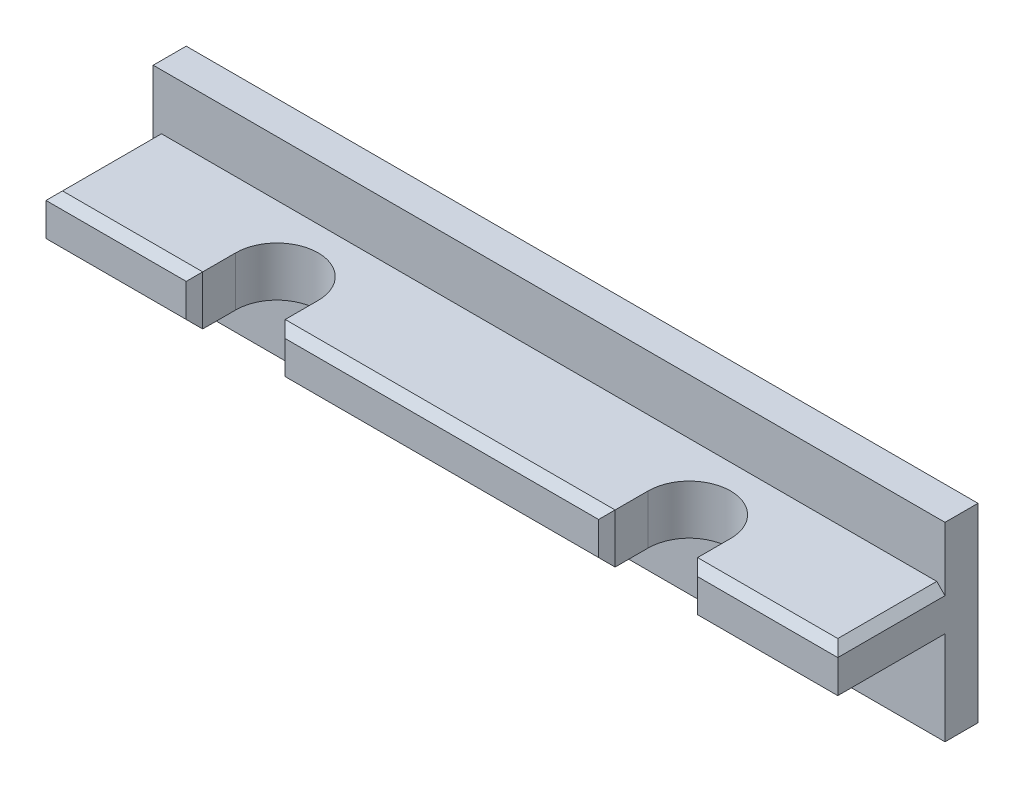
ISO-10303-21;
HEADER;
FILE_DESCRIPTION(('STEP AP214'),'2;1');
FILE_NAME('part.step','',(''),(''),'','','');
FILE_SCHEMA(('AUTOMOTIVE_DESIGN { 1 0 10303 214 1 1 1 1 }'));
ENDSEC;
DATA;
#1=APPLICATION_CONTEXT('core data for automotive mechanical design processes');
#2=APPLICATION_PROTOCOL_DEFINITION('international standard','automotive_design',2000,#1);
#3=PRODUCT_CONTEXT('',#1,'mechanical');
#4=PRODUCT('Part','Part','',(#3));
#5=PRODUCT_RELATED_PRODUCT_CATEGORY('part','',(#4));
#6=PRODUCT_DEFINITION_FORMATION('','',#4);
#7=PRODUCT_DEFINITION_CONTEXT('part definition',#1,'design');
#8=PRODUCT_DEFINITION('design','',#6,#7);
#9=PRODUCT_DEFINITION_SHAPE('','',#8);
#10=(LENGTH_UNIT() NAMED_UNIT(*) SI_UNIT(.MILLI.,.METRE.));
#11=(NAMED_UNIT(*) PLANE_ANGLE_UNIT() SI_UNIT($,.RADIAN.));
#12=(NAMED_UNIT(*) SI_UNIT($,.STERADIAN.) SOLID_ANGLE_UNIT());
#13=UNCERTAINTY_MEASURE_WITH_UNIT(LENGTH_MEASURE(1.E-05),#10,'distance_accuracy_value','');
#14=(GEOMETRIC_REPRESENTATION_CONTEXT(3) GLOBAL_UNCERTAINTY_ASSIGNED_CONTEXT((#13)) GLOBAL_UNIT_ASSIGNED_CONTEXT((#10,
#11,#12)) REPRESENTATION_CONTEXT('',''));
#15=CARTESIAN_POINT('',(0.,0.,0.));
#16=DIRECTION('',(0.,0.,1.));
#17=DIRECTION('',(1.,0.,0.));
#18=AXIS2_PLACEMENT_3D('',#15,#16,#17);
#19=CARTESIAN_POINT('',(0.,0.,8.5));
#20=DIRECTION('',(0.,0.,1.));
#21=DIRECTION('',(1.,0.,0.));
#22=AXIS2_PLACEMENT_3D('',#19,#20,#21);
#23=PLANE('',#22);
#24=DIRECTION('',(1.,0.,0.));
#25=VECTOR('',#24,1.);
#26=CARTESIAN_POINT('',(10.,5.67500000000001,8.5));
#27=LINE('',#26,#25);
#28=CARTESIAN_POINT('',(-9.5,5.675,8.5));
#29=VERTEX_POINT('',#28);
#30=CARTESIAN_POINT('',(9.5,5.67500000000001,8.5));
#31=VERTEX_POINT('',#30);
#32=EDGE_CURVE('E401',#29,#31,#27,.T.);
#33=ORIENTED_EDGE('',*,*,#32,.T.);
#34=DIRECTION('',(0.,1.,0.));
#35=VECTOR('',#34,1.);
#36=CARTESIAN_POINT('',(9.5,8.17500000000001,8.5));
#37=LINE('',#36,#35);
#38=CARTESIAN_POINT('',(9.5,7.67500000000001,8.5));
#39=VERTEX_POINT('',#38);
#40=EDGE_CURVE('E404',#31,#39,#37,.T.);
#41=ORIENTED_EDGE('',*,*,#40,.T.);
#42=DIRECTION('',(-1.,0.,0.));
#43=VECTOR('',#42,1.);
#44=CARTESIAN_POINT('',(0.,7.67500000000001,8.5));
#45=LINE('',#44,#43);
#46=CARTESIAN_POINT('',(-9.5,7.675,8.5));
#47=VERTEX_POINT('',#46);
#48=EDGE_CURVE('E395',#39,#47,#45,.T.);
#49=ORIENTED_EDGE('',*,*,#48,.T.);
#50=DIRECTION('',(0.,-1.,0.));
#51=VECTOR('',#50,1.);
#52=CARTESIAN_POINT('',(-9.5,5.175,8.5));
#53=LINE('',#52,#51);
#54=EDGE_CURVE('E398',#47,#29,#53,.T.);
#55=ORIENTED_EDGE('',*,*,#54,.T.);
#56=EDGE_LOOP('',(#33,#41,#49,#55));
#57=FACE_BOUND('',#56,.T.);
#58=ADVANCED_FACE('F46',(#57),#23,.T.);
#59=DIRECTION('',(0.,-1.,0.));
#60=VECTOR('',#59,1.);
#61=CARTESIAN_POINT('',(15.5,5.17500000000001,8.5));
#62=LINE('',#61,#60);
#63=CARTESIAN_POINT('',(15.5,7.67499999999999,8.5));
#64=VERTEX_POINT('',#63);
#65=CARTESIAN_POINT('',(15.5,5.67500000000002,8.5));
#66=VERTEX_POINT('',#65);
#67=EDGE_CURVE('E65',#64,#66,#62,.T.);
#68=ORIENTED_EDGE('',*,*,#67,.T.);
#69=DIRECTION('',(1.,0.,0.));
#70=VECTOR('',#69,1.);
#71=CARTESIAN_POINT('',(24.,5.67500000000002,8.5));
#72=LINE('',#71,#70);
#73=CARTESIAN_POINT('',(24.,5.67500000000002,8.5));
#74=VERTEX_POINT('',#73);
#75=EDGE_CURVE('E422',#66,#74,#72,.T.);
#76=ORIENTED_EDGE('',*,*,#75,.T.);
#77=DIRECTION('',(0.,1.,0.));
#78=VECTOR('',#77,1.);
#79=CARTESIAN_POINT('',(24.,0.,8.5));
#80=LINE('',#79,#78);
#81=CARTESIAN_POINT('',(24.,7.675,8.5));
#82=VERTEX_POINT('',#81);
#83=EDGE_CURVE('E289',#74,#82,#80,.T.);
#84=ORIENTED_EDGE('',*,*,#83,.T.);
#85=DIRECTION('',(-1.,0.,0.));
#86=VECTOR('',#85,1.);
#87=CARTESIAN_POINT('',(0.,7.67499999999999,8.5));
#88=LINE('',#87,#86);
#89=EDGE_CURVE('E70',#82,#64,#88,.T.);
#90=ORIENTED_EDGE('',*,*,#89,.T.);
#91=EDGE_LOOP('',(#68,#76,#84,#90));
#92=FACE_BOUND('',#91,.T.);
#93=ADVANCED_FACE('F553',(#92),#23,.T.);
#94=CARTESIAN_POINT('',(0.,0.,2.));
#95=DIRECTION('',(0.,0.,1.));
#96=DIRECTION('',(1.,0.,0.));
#97=AXIS2_PLACEMENT_3D('',#94,#95,#96);
#98=PLANE('',#97);
#99=DIRECTION('',(0.,1.,0.));
#100=VECTOR('',#99,1.);
#101=CARTESIAN_POINT('',(24.,0.,2.));
#102=LINE('',#101,#100);
#103=CARTESIAN_POINT('',(24.,0.,2.));
#104=VERTEX_POINT('',#103);
#105=CARTESIAN_POINT('',(24.,5.67500000000002,2.));
#106=VERTEX_POINT('',#105);
#107=EDGE_CURVE('E300',#104,#106,#102,.T.);
#108=ORIENTED_EDGE('',*,*,#107,.T.);
#109=DIRECTION('',(0.707106781186546,0.707106781186549,0.));
#110=VECTOR('',#109,1.);
#111=CARTESIAN_POINT('',(24.,5.67500000000002,2.));
#112=LINE('',#111,#110);
#113=CARTESIAN_POINT('',(23.5,5.17500000000001,2.));
#114=VERTEX_POINT('',#113);
#115=EDGE_CURVE('E57',#106,#114,#112,.F.);
#116=ORIENTED_EDGE('',*,*,#115,.T.);
#117=DIRECTION('',(-1.,0.,0.));
#118=VECTOR('',#117,1.);
#119=CARTESIAN_POINT('',(0.,5.175,2.));
#120=LINE('',#119,#118);
#121=CARTESIAN_POINT('',(-23.5,5.175,2.));
#122=VERTEX_POINT('',#121);
#123=EDGE_CURVE('E295',#114,#122,#120,.T.);
#124=ORIENTED_EDGE('',*,*,#123,.T.);
#125=DIRECTION('',(0.707106781186543,-0.707106781186552,0.));
#126=VECTOR('',#125,1.);
#127=CARTESIAN_POINT('',(-23.5,5.175,2.));
#128=LINE('',#127,#126);
#129=CARTESIAN_POINT('',(-24.,5.67499999999999,2.));
#130=VERTEX_POINT('',#129);
#131=EDGE_CURVE('E427',#122,#130,#128,.F.);
#132=ORIENTED_EDGE('',*,*,#131,.T.);
#133=DIRECTION('',(0.,-1.,0.));
#134=VECTOR('',#133,1.);
#135=CARTESIAN_POINT('',(-24.,0.,2.));
#136=LINE('',#135,#134);
#137=CARTESIAN_POINT('',(-24.,0.,2.));
#138=VERTEX_POINT('',#137);
#139=EDGE_CURVE('E307',#130,#138,#136,.T.);
#140=ORIENTED_EDGE('',*,*,#139,.T.);
#141=DIRECTION('',(1.,0.,0.));
#142=VECTOR('',#141,1.);
#143=CARTESIAN_POINT('',(0.,0.,2.));
#144=LINE('',#143,#142);
#145=EDGE_CURVE('E311',#138,#104,#144,.T.);
#146=ORIENTED_EDGE('',*,*,#145,.T.);
#147=EDGE_LOOP('',(#108,#116,#124,#132,#140,#146));
#148=FACE_BOUND('',#147,.T.);
#149=ADVANCED_FACE('F563',(#148),#98,.T.);
#150=CARTESIAN_POINT('',(24.,0.,2.));
#151=DIRECTION('',(-1.,0.,0.));
#152=DIRECTION('',(0.,-1.,0.));
#153=AXIS2_PLACEMENT_3D('',#150,#151,#152);
#154=PLANE('',#153);
#155=ORIENTED_EDGE('',*,*,#83,.F.);
#156=DIRECTION('',(0.,0.,-1.));
#157=VECTOR('',#156,1.);
#158=CARTESIAN_POINT('',(24.,5.67500000000002,2.));
#159=LINE('',#158,#157);
#160=EDGE_CURVE('E414',#74,#106,#159,.T.);
#161=ORIENTED_EDGE('',*,*,#160,.T.);
#162=ORIENTED_EDGE('',*,*,#107,.F.);
#163=DIRECTION('',(0.,0.,-1.));
#164=VECTOR('',#163,1.);
#165=CARTESIAN_POINT('',(24.,0.,2.));
#166=LINE('',#165,#164);
#167=CARTESIAN_POINT('',(24.,0.,0.));
#168=VERTEX_POINT('',#167);
#169=EDGE_CURVE('E314',#104,#168,#166,.T.);
#170=ORIENTED_EDGE('',*,*,#169,.T.);
#171=DIRECTION('',(0.,1.,0.));
#172=VECTOR('',#171,1.);
#173=CARTESIAN_POINT('',(24.,0.,0.));
#174=LINE('',#173,#172);
#175=CARTESIAN_POINT('',(24.,11.525,0.));
#176=VERTEX_POINT('',#175);
#177=EDGE_CURVE('E299',#168,#176,#174,.T.);
#178=ORIENTED_EDGE('',*,*,#177,.T.);
#179=DIRECTION('',(0.,0.,-1.));
#180=VECTOR('',#179,1.);
#181=CARTESIAN_POINT('',(24.,11.525,2.));
#182=LINE('',#181,#180);
#183=CARTESIAN_POINT('',(24.,11.525,2.));
#184=VERTEX_POINT('',#183);
#185=EDGE_CURVE('E337',#184,#176,#182,.T.);
#186=ORIENTED_EDGE('',*,*,#185,.F.);
#187=CARTESIAN_POINT('',(24.,7.675,2.));
#188=VERTEX_POINT('',#187);
#189=EDGE_CURVE('E304',#188,#184,#102,.T.);
#190=ORIENTED_EDGE('',*,*,#189,.F.);
#191=DIRECTION('',(0.,0.,1.));
#192=VECTOR('',#191,1.);
#193=CARTESIAN_POINT('',(24.,7.675,8.5));
#194=LINE('',#193,#192);
#195=EDGE_CURVE('E411',#188,#82,#194,.T.);
#196=ORIENTED_EDGE('',*,*,#195,.T.);
#197=EDGE_LOOP('',(#155,#161,#162,#170,#178,#186,#190,#196));
#198=FACE_BOUND('',#197,.T.);
#199=ADVANCED_FACE('F555',(#198),#154,.F.);
#200=CARTESIAN_POINT('',(0.,11.525,2.));
#201=DIRECTION('',(0.,-1.,0.));
#202=DIRECTION('',(1.,0.,0.));
#203=AXIS2_PLACEMENT_3D('',#200,#201,#202);
#204=PLANE('',#203);
#205=DIRECTION('',(-1.,0.,0.));
#206=VECTOR('',#205,1.);
#207=CARTESIAN_POINT('',(0.,11.525,0.));
#208=LINE('',#207,#206);
#209=CARTESIAN_POINT('',(-24.,11.525,0.));
#210=VERTEX_POINT('',#209);
#211=EDGE_CURVE('E317',#176,#210,#208,.T.);
#212=ORIENTED_EDGE('',*,*,#211,.T.);
#213=DIRECTION('',(0.,0.,-1.));
#214=VECTOR('',#213,1.);
#215=CARTESIAN_POINT('',(-24.,11.525,2.));
#216=LINE('',#215,#214);
#217=CARTESIAN_POINT('',(-24.,11.525,2.));
#218=VERTEX_POINT('',#217);
#219=EDGE_CURVE('E333',#218,#210,#216,.T.);
#220=ORIENTED_EDGE('',*,*,#219,.F.);
#221=DIRECTION('',(-1.,0.,0.));
#222=VECTOR('',#221,1.);
#223=CARTESIAN_POINT('',(0.,11.525,2.));
#224=LINE('',#223,#222);
#225=EDGE_CURVE('E303',#184,#218,#224,.T.);
#226=ORIENTED_EDGE('',*,*,#225,.F.);
#227=ORIENTED_EDGE('',*,*,#185,.T.);
#228=EDGE_LOOP('',(#212,#220,#226,#227));
#229=FACE_BOUND('',#228,.T.);
#230=ADVANCED_FACE('F876',(#229),#204,.F.);
#231=CARTESIAN_POINT('',(-24.,0.,2.));
#232=DIRECTION('',(1.,0.,0.));
#233=DIRECTION('',(0.,1.,0.));
#234=AXIS2_PLACEMENT_3D('',#231,#232,#233);
#235=PLANE('',#234);
#236=ORIENTED_EDGE('',*,*,#139,.F.);
#237=DIRECTION('',(0.,0.,1.));
#238=VECTOR('',#237,1.);
#239=CARTESIAN_POINT('',(-24.,5.67499999999999,2.));
#240=LINE('',#239,#238);
#241=CARTESIAN_POINT('',(-24.,5.67499999999999,8.5));
#242=VERTEX_POINT('',#241);
#243=EDGE_CURVE('E361',#130,#242,#240,.T.);
#244=ORIENTED_EDGE('',*,*,#243,.T.);
#245=DIRECTION('',(0.,-1.,0.));
#246=VECTOR('',#245,1.);
#247=CARTESIAN_POINT('',(-24.,0.,8.5));
#248=LINE('',#247,#246);
#249=CARTESIAN_POINT('',(-24.,7.67500000000001,8.5));
#250=VERTEX_POINT('',#249);
#251=EDGE_CURVE('E285',#250,#242,#248,.T.);
#252=ORIENTED_EDGE('',*,*,#251,.F.);
#253=DIRECTION('',(0.,0.,-1.));
#254=VECTOR('',#253,1.);
#255=CARTESIAN_POINT('',(-24.,7.67500000000001,2.));
#256=LINE('',#255,#254);
#257=CARTESIAN_POINT('',(-24.,7.67500000000001,2.));
#258=VERTEX_POINT('',#257);
#259=EDGE_CURVE('E357',#250,#258,#256,.T.);
#260=ORIENTED_EDGE('',*,*,#259,.T.);
#261=EDGE_CURVE('E308',#218,#258,#136,.T.);
#262=ORIENTED_EDGE('',*,*,#261,.F.);
#263=ORIENTED_EDGE('',*,*,#219,.T.);
#264=DIRECTION('',(0.,-1.,0.));
#265=VECTOR('',#264,1.);
#266=CARTESIAN_POINT('',(-24.,0.,0.));
#267=LINE('',#266,#265);
#268=CARTESIAN_POINT('',(-24.,0.,0.));
#269=VERTEX_POINT('',#268);
#270=EDGE_CURVE('E320',#210,#269,#267,.T.);
#271=ORIENTED_EDGE('',*,*,#270,.T.);
#272=DIRECTION('',(0.,0.,-1.));
#273=VECTOR('',#272,1.);
#274=CARTESIAN_POINT('',(-24.,0.,2.));
#275=LINE('',#274,#273);
#276=EDGE_CURVE('E329',#138,#269,#275,.T.);
#277=ORIENTED_EDGE('',*,*,#276,.F.);
#278=EDGE_LOOP('',(#236,#244,#252,#260,#262,#263,#271,#277));
#279=FACE_BOUND('',#278,.T.);
#280=ADVANCED_FACE('F568',(#279),#235,.F.);
#281=CARTESIAN_POINT('',(0.,0.,2.));
#282=DIRECTION('',(0.,1.,0.));
#283=DIRECTION('',(-1.,0.,0.));
#284=AXIS2_PLACEMENT_3D('',#281,#282,#283);
#285=PLANE('',#284);
#286=DIRECTION('',(1.,0.,0.));
#287=VECTOR('',#286,1.);
#288=CARTESIAN_POINT('',(0.,0.,0.));
#289=LINE('',#288,#287);
#290=EDGE_CURVE('E323',#269,#168,#289,.T.);
#291=ORIENTED_EDGE('',*,*,#290,.T.);
#292=ORIENTED_EDGE('',*,*,#169,.F.);
#293=ORIENTED_EDGE('',*,*,#145,.F.);
#294=ORIENTED_EDGE('',*,*,#276,.T.);
#295=EDGE_LOOP('',(#291,#292,#293,#294));
#296=FACE_BOUND('',#295,.T.);
#297=ADVANCED_FACE('F572',(#296),#285,.F.);
#298=DIRECTION('',(-1.,0.,0.));
#299=VECTOR('',#298,1.);
#300=CARTESIAN_POINT('',(0.,8.17500000000001,2.));
#301=LINE('',#300,#299);
#302=CARTESIAN_POINT('',(23.5,8.17500000000001,2.));
#303=VERTEX_POINT('',#302);
#304=CARTESIAN_POINT('',(-23.5,8.175,2.));
#305=VERTEX_POINT('',#304);
#306=EDGE_CURVE('E292',#303,#305,#301,.T.);
#307=ORIENTED_EDGE('',*,*,#306,.F.);
#308=DIRECTION('',(0.707106781186548,-0.707106781186547,0.));
#309=VECTOR('',#308,1.);
#310=CARTESIAN_POINT('',(23.5,8.17500000000001,2.));
#311=LINE('',#310,#309);
#312=EDGE_CURVE('E11',#303,#188,#311,.T.);
#313=ORIENTED_EDGE('',*,*,#312,.T.);
#314=ORIENTED_EDGE('',*,*,#189,.T.);
#315=ORIENTED_EDGE('',*,*,#225,.T.);
#316=ORIENTED_EDGE('',*,*,#261,.T.);
#317=DIRECTION('',(0.707106781186542,0.707106781186553,0.));
#318=VECTOR('',#317,1.);
#319=CARTESIAN_POINT('',(-24.,7.67500000000001,2.));
#320=LINE('',#319,#318);
#321=EDGE_CURVE('E431',#258,#305,#320,.T.);
#322=ORIENTED_EDGE('',*,*,#321,.T.);
#323=EDGE_LOOP('',(#307,#313,#314,#315,#316,#322));
#324=FACE_BOUND('',#323,.T.);
#325=ADVANCED_FACE('F488',(#324),#98,.T.);
#326=CARTESIAN_POINT('',(0.,0.,0.));
#327=DIRECTION('',(0.,0.,1.));
#328=DIRECTION('',(1.,0.,0.));
#329=AXIS2_PLACEMENT_3D('',#326,#327,#328);
#330=PLANE('',#329);
#331=ORIENTED_EDGE('',*,*,#211,.F.);
#332=ORIENTED_EDGE('',*,*,#177,.F.);
#333=ORIENTED_EDGE('',*,*,#290,.F.);
#334=ORIENTED_EDGE('',*,*,#270,.F.);
#335=EDGE_LOOP('',(#331,#332,#333,#334));
#336=FACE_BOUND('',#335,.T.);
#337=ADVANCED_FACE('F832',(#336),#330,.F.);
#338=CARTESIAN_POINT('',(0.,5.175,8.5));
#339=DIRECTION('',(0.,1.,0.));
#340=DIRECTION('',(-1.,0.,0.));
#341=AXIS2_PLACEMENT_3D('',#338,#339,#340);
#342=PLANE('',#341);
#343=DIRECTION('',(-1.,0.,0.));
#344=VECTOR('',#343,1.);
#345=CARTESIAN_POINT('',(-24.,5.175,8.00000000000001));
#346=LINE('',#345,#344);
#347=CARTESIAN_POINT('',(-15.,5.175,8.00000000000001));
#348=VERTEX_POINT('',#347);
#349=CARTESIAN_POINT('',(-23.5,5.175,8.00000000000001));
#350=VERTEX_POINT('',#349);
#351=EDGE_CURVE('E350',#348,#350,#346,.T.);
#352=ORIENTED_EDGE('',*,*,#351,.T.);
#353=DIRECTION('',(0.,0.,-1.));
#354=VECTOR('',#353,1.);
#355=CARTESIAN_POINT('',(-23.5,5.175,8.5));
#356=LINE('',#355,#354);
#357=EDGE_CURVE('E353',#350,#122,#356,.T.);
#358=ORIENTED_EDGE('',*,*,#357,.T.);
#359=ORIENTED_EDGE('',*,*,#123,.F.);
#360=DIRECTION('',(0.,0.,1.));
#361=VECTOR('',#360,1.);
#362=CARTESIAN_POINT('',(23.5,5.17500000000001,8.5));
#363=LINE('',#362,#361);
#364=CARTESIAN_POINT('',(23.5,5.17500000000001,7.99999999999999));
#365=VERTEX_POINT('',#364);
#366=EDGE_CURVE('E344',#114,#365,#363,.T.);
#367=ORIENTED_EDGE('',*,*,#366,.T.);
#368=DIRECTION('',(-1.,0.,0.));
#369=VECTOR('',#368,1.);
#370=CARTESIAN_POINT('',(15.,5.17500000000001,7.99999999999999));
#371=LINE('',#370,#369);
#372=CARTESIAN_POINT('',(15.,5.17500000000001,7.99999999999999));
#373=VERTEX_POINT('',#372);
#374=EDGE_CURVE('E341',#365,#373,#371,.T.);
#375=ORIENTED_EDGE('',*,*,#374,.T.);
#376=DIRECTION('',(0.,0.,-1.));
#377=VECTOR('',#376,1.);
#378=CARTESIAN_POINT('',(15.,5.17500000000001,8.5));
#379=LINE('',#378,#377);
#380=CARTESIAN_POINT('',(15.,5.17500000000001,6.));
#381=VERTEX_POINT('',#380);
#382=EDGE_CURVE('E272',#373,#381,#379,.T.);
#383=ORIENTED_EDGE('',*,*,#382,.T.);
#384=CARTESIAN_POINT('',(12.5,5.17500000000001,6.));
#385=DIRECTION('',(0.,1.,0.));
#386=DIRECTION('',(-1.,0.,0.));
#387=AXIS2_PLACEMENT_3D('',#384,#385,#386);
#388=CIRCLE('',#387,2.5);
#389=CARTESIAN_POINT('',(10.,5.17500000000001,6.));
#390=VERTEX_POINT('',#389);
#391=EDGE_CURVE('E232',#381,#390,#388,.T.);
#392=ORIENTED_EDGE('',*,*,#391,.T.);
#393=DIRECTION('',(0.,0.,1.));
#394=VECTOR('',#393,1.);
#395=CARTESIAN_POINT('',(10.,5.17500000000001,8.5));
#396=LINE('',#395,#394);
#397=CARTESIAN_POINT('',(10.,5.17500000000001,8.00000000000001));
#398=VERTEX_POINT('',#397);
#399=EDGE_CURVE('E275',#390,#398,#396,.T.);
#400=ORIENTED_EDGE('',*,*,#399,.T.);
#401=DIRECTION('',(-1.,0.,0.));
#402=VECTOR('',#401,1.);
#403=CARTESIAN_POINT('',(-10.,5.175,8.00000000000001));
#404=LINE('',#403,#402);
#405=CARTESIAN_POINT('',(-10.,5.175,8.00000000000001));
#406=VERTEX_POINT('',#405);
#407=EDGE_CURVE('E347',#398,#406,#404,.T.);
#408=ORIENTED_EDGE('',*,*,#407,.T.);
#409=DIRECTION('',(0.,0.,-1.));
#410=VECTOR('',#409,1.);
#411=CARTESIAN_POINT('',(-10.,5.175,8.5));
#412=LINE('',#411,#410);
#413=CARTESIAN_POINT('',(-10.,5.175,6.));
#414=VERTEX_POINT('',#413);
#415=EDGE_CURVE('E269',#406,#414,#412,.T.);
#416=ORIENTED_EDGE('',*,*,#415,.T.);
#417=CARTESIAN_POINT('',(-12.5,5.175,6.));
#418=DIRECTION('',(0.,1.,0.));
#419=DIRECTION('',(-1.,0.,0.));
#420=AXIS2_PLACEMENT_3D('',#417,#418,#419);
#421=CIRCLE('',#420,2.5);
#422=CARTESIAN_POINT('',(-15.,5.175,6.));
#423=VERTEX_POINT('',#422);
#424=EDGE_CURVE('E279',#414,#423,#421,.T.);
#425=ORIENTED_EDGE('',*,*,#424,.T.);
#426=DIRECTION('',(0.,0.,1.));
#427=VECTOR('',#426,1.);
#428=CARTESIAN_POINT('',(-15.,5.175,8.5));
#429=LINE('',#428,#427);
#430=EDGE_CURVE('E246',#423,#348,#429,.T.);
#431=ORIENTED_EDGE('',*,*,#430,.T.);
#432=EDGE_LOOP('',(#352,#358,#359,#367,#375,#383,#392,#400,#408,#416,#425,#431));
#433=FACE_BOUND('',#432,.T.);
#434=ADVANCED_FACE('F517',(#433),#342,.F.);
#435=CARTESIAN_POINT('',(0.,8.17500000000001,8.5));
#436=DIRECTION('',(0.,1.,0.));
#437=DIRECTION('',(-1.,0.,0.));
#438=AXIS2_PLACEMENT_3D('',#435,#436,#437);
#439=PLANE('',#438);
#440=ORIENTED_EDGE('',*,*,#306,.T.);
#441=DIRECTION('',(0.,0.,1.));
#442=VECTOR('',#441,1.);
#443=CARTESIAN_POINT('',(-23.5,8.175,8.5));
#444=LINE('',#443,#442);
#445=CARTESIAN_POINT('',(-23.5,8.175,8.00000000000001));
#446=VERTEX_POINT('',#445);
#447=EDGE_CURVE('E388',#305,#446,#444,.T.);
#448=ORIENTED_EDGE('',*,*,#447,.T.);
#449=DIRECTION('',(1.,0.,0.));
#450=VECTOR('',#449,1.);
#451=CARTESIAN_POINT('',(0.,8.17500000000001,8.00000000000001));
#452=LINE('',#451,#450);
#453=CARTESIAN_POINT('',(-15.,8.175,8.00000000000001));
#454=VERTEX_POINT('',#453);
#455=EDGE_CURVE('E385',#446,#454,#452,.T.);
#456=ORIENTED_EDGE('',*,*,#455,.T.);
#457=DIRECTION('',(0.,0.,1.));
#458=VECTOR('',#457,1.);
#459=CARTESIAN_POINT('',(-15.,8.175,6.));
#460=LINE('',#459,#458);
#461=CARTESIAN_POINT('',(-15.,8.175,6.));
#462=VERTEX_POINT('',#461);
#463=EDGE_CURVE('E259',#462,#454,#460,.T.);
#464=ORIENTED_EDGE('',*,*,#463,.F.);
#465=CARTESIAN_POINT('',(-12.5,8.175,6.));
#466=DIRECTION('',(0.,1.,0.));
#467=DIRECTION('',(-1.,0.,0.));
#468=AXIS2_PLACEMENT_3D('',#465,#466,#467);
#469=CIRCLE('',#468,2.5);
#470=CARTESIAN_POINT('',(-10.,8.175,6.));
#471=VERTEX_POINT('',#470);
#472=EDGE_CURVE('E223',#471,#462,#469,.T.);
#473=ORIENTED_EDGE('',*,*,#472,.F.);
#474=DIRECTION('',(0.,0.,-1.));
#475=VECTOR('',#474,1.);
#476=CARTESIAN_POINT('',(-10.,8.175,8.5));
#477=LINE('',#476,#475);
#478=CARTESIAN_POINT('',(-10.,8.175,8.00000000000001));
#479=VERTEX_POINT('',#478);
#480=EDGE_CURVE('E251',#479,#471,#477,.T.);
#481=ORIENTED_EDGE('',*,*,#480,.F.);
#482=DIRECTION('',(1.,0.,0.));
#483=VECTOR('',#482,1.);
#484=CARTESIAN_POINT('',(0.,8.17500000000001,8.00000000000001));
#485=LINE('',#484,#483);
#486=CARTESIAN_POINT('',(10.,8.17500000000001,8.00000000000001));
#487=VERTEX_POINT('',#486);
#488=EDGE_CURVE('E382',#479,#487,#485,.T.);
#489=ORIENTED_EDGE('',*,*,#488,.T.);
#490=DIRECTION('',(0.,0.,1.));
#491=VECTOR('',#490,1.);
#492=CARTESIAN_POINT('',(10.,8.17500000000001,8.5));
#493=LINE('',#492,#491);
#494=CARTESIAN_POINT('',(10.,8.17500000000001,6.));
#495=VERTEX_POINT('',#494);
#496=EDGE_CURVE('E235',#495,#487,#493,.T.);
#497=ORIENTED_EDGE('',*,*,#496,.F.);
#498=CARTESIAN_POINT('',(12.5,8.17500000000001,6.));
#499=DIRECTION('',(0.,1.,0.));
#500=DIRECTION('',(1.,0.,0.));
#501=AXIS2_PLACEMENT_3D('',#498,#499,#500);
#502=CIRCLE('',#501,2.5);
#503=CARTESIAN_POINT('',(15.,8.17500000000001,6.));
#504=VERTEX_POINT('',#503);
#505=EDGE_CURVE('E222',#504,#495,#502,.T.);
#506=ORIENTED_EDGE('',*,*,#505,.F.);
#507=DIRECTION('',(0.,0.,-1.));
#508=VECTOR('',#507,1.);
#509=CARTESIAN_POINT('',(15.,8.17500000000001,5.99999999999999));
#510=LINE('',#509,#508);
#511=CARTESIAN_POINT('',(15.,8.17500000000001,7.99999999999999));
#512=VERTEX_POINT('',#511);
#513=EDGE_CURVE('E211',#512,#504,#510,.T.);
#514=ORIENTED_EDGE('',*,*,#513,.F.);
#515=DIRECTION('',(1.,0.,0.));
#516=VECTOR('',#515,1.);
#517=CARTESIAN_POINT('',(0.,8.17500000000001,7.99999999999999));
#518=LINE('',#517,#516);
#519=CARTESIAN_POINT('',(23.5,8.17500000000001,7.99999999999999));
#520=VERTEX_POINT('',#519);
#521=EDGE_CURVE('E379',#512,#520,#518,.T.);
#522=ORIENTED_EDGE('',*,*,#521,.T.);
#523=DIRECTION('',(0.,0.,-1.));
#524=VECTOR('',#523,1.);
#525=CARTESIAN_POINT('',(23.5,8.17500000000001,2.));
#526=LINE('',#525,#524);
#527=EDGE_CURVE('E376',#520,#303,#526,.T.);
#528=ORIENTED_EDGE('',*,*,#527,.T.);
#529=EDGE_LOOP('',(#440,#448,#456,#464,#473,#481,#489,#497,#506,#514,#522,#528));
#530=FACE_BOUND('',#529,.T.);
#531=ADVANCED_FACE('F238',(#530),#439,.T.);
#532=ORIENTED_EDGE('',*,*,#251,.T.);
#533=DIRECTION('',(1.,0.,0.));
#534=VECTOR('',#533,1.);
#535=CARTESIAN_POINT('',(-15.,5.675,8.5));
#536=LINE('',#535,#534);
#537=CARTESIAN_POINT('',(-15.5,5.675,8.5));
#538=VERTEX_POINT('',#537);
#539=EDGE_CURVE('E370',#242,#538,#536,.T.);
#540=ORIENTED_EDGE('',*,*,#539,.T.);
#541=DIRECTION('',(0.,1.,0.));
#542=VECTOR('',#541,1.);
#543=CARTESIAN_POINT('',(-15.5,8.175,8.5));
#544=LINE('',#543,#542);
#545=CARTESIAN_POINT('',(-15.5,7.67500000000001,8.5));
#546=VERTEX_POINT('',#545);
#547=EDGE_CURVE('E367',#538,#546,#544,.T.);
#548=ORIENTED_EDGE('',*,*,#547,.T.);
#549=DIRECTION('',(-1.,0.,0.));
#550=VECTOR('',#549,1.);
#551=CARTESIAN_POINT('',(0.,7.67500000000001,8.5));
#552=LINE('',#551,#550);
#553=EDGE_CURVE('E364',#546,#250,#552,.T.);
#554=ORIENTED_EDGE('',*,*,#553,.T.);
#555=EDGE_LOOP('',(#532,#540,#548,#554));
#556=FACE_BOUND('',#555,.T.);
#557=ADVANCED_FACE('F589',(#556),#23,.T.);
#558=CARTESIAN_POINT('',(-12.5,0.,6.));
#559=DIRECTION('',(0.,1.,0.));
#560=DIRECTION('',(-1.,0.,0.));
#561=AXIS2_PLACEMENT_3D('',#558,#559,#560);
#562=CYLINDRICAL_SURFACE('',#561,2.5);
#563=DIRECTION('',(0.,1.,0.));
#564=VECTOR('',#563,1.);
#565=CARTESIAN_POINT('',(-10.,0.,6.));
#566=LINE('',#565,#564);
#567=EDGE_CURVE('E252',#414,#471,#566,.T.);
#568=ORIENTED_EDGE('',*,*,#567,.T.);
#569=ORIENTED_EDGE('',*,*,#472,.T.);
#570=DIRECTION('',(0.,1.,0.));
#571=VECTOR('',#570,1.);
#572=CARTESIAN_POINT('',(-15.,0.,6.));
#573=LINE('',#572,#571);
#574=EDGE_CURVE('E248',#423,#462,#573,.T.);
#575=ORIENTED_EDGE('',*,*,#574,.F.);
#576=ORIENTED_EDGE('',*,*,#424,.F.);
#577=EDGE_LOOP('',(#568,#569,#575,#576));
#578=FACE_BOUND('',#577,.T.);
#579=ADVANCED_FACE('F521',(#578),#562,.F.);
#580=CARTESIAN_POINT('',(-10.,0.,8.5));
#581=DIRECTION('',(1.,0.,0.));
#582=DIRECTION('',(0.,1.,0.));
#583=AXIS2_PLACEMENT_3D('',#580,#581,#582);
#584=PLANE('',#583);
#585=ORIENTED_EDGE('',*,*,#415,.F.);
#586=DIRECTION('',(0.,1.,0.));
#587=VECTOR('',#586,1.);
#588=CARTESIAN_POINT('',(-10.,8.175,8.00000000000001));
#589=LINE('',#588,#587);
#590=EDGE_CURVE('E408',#406,#479,#589,.T.);
#591=ORIENTED_EDGE('',*,*,#590,.T.);
#592=ORIENTED_EDGE('',*,*,#480,.T.);
#593=ORIENTED_EDGE('',*,*,#567,.F.);
#594=EDGE_LOOP('',(#585,#591,#592,#593));
#595=FACE_BOUND('',#594,.T.);
#596=ADVANCED_FACE('F601',(#595),#584,.F.);
#597=CARTESIAN_POINT('',(-15.,0.,6.));
#598=DIRECTION('',(-1.,0.,0.));
#599=DIRECTION('',(0.,-1.,0.));
#600=AXIS2_PLACEMENT_3D('',#597,#598,#599);
#601=PLANE('',#600);
#602=ORIENTED_EDGE('',*,*,#463,.T.);
#603=DIRECTION('',(0.,-1.,0.));
#604=VECTOR('',#603,1.);
#605=CARTESIAN_POINT('',(-15.,5.175,8.00000000000001));
#606=LINE('',#605,#604);
#607=EDGE_CURVE('E373',#454,#348,#606,.T.);
#608=ORIENTED_EDGE('',*,*,#607,.T.);
#609=ORIENTED_EDGE('',*,*,#430,.F.);
#610=ORIENTED_EDGE('',*,*,#574,.T.);
#611=EDGE_LOOP('',(#602,#608,#609,#610));
#612=FACE_BOUND('',#611,.T.);
#613=ADVANCED_FACE('F501',(#612),#601,.F.);
#614=CARTESIAN_POINT('',(12.5,0.,6.));
#615=DIRECTION('',(0.,1.,0.));
#616=DIRECTION('',(-1.,0.,0.));
#617=AXIS2_PLACEMENT_3D('',#614,#615,#616);
#618=CYLINDRICAL_SURFACE('',#617,2.5);
#619=DIRECTION('',(0.,1.,0.));
#620=VECTOR('',#619,1.);
#621=CARTESIAN_POINT('',(15.,0.,6.));
#622=LINE('',#621,#620);
#623=EDGE_CURVE('E215',#381,#504,#622,.T.);
#624=ORIENTED_EDGE('',*,*,#623,.T.);
#625=ORIENTED_EDGE('',*,*,#505,.T.);
#626=DIRECTION('',(0.,1.,0.));
#627=VECTOR('',#626,1.);
#628=CARTESIAN_POINT('',(10.,0.,6.));
#629=LINE('',#628,#627);
#630=EDGE_CURVE('E234',#390,#495,#629,.T.);
#631=ORIENTED_EDGE('',*,*,#630,.F.);
#632=ORIENTED_EDGE('',*,*,#391,.F.);
#633=EDGE_LOOP('',(#624,#625,#631,#632));
#634=FACE_BOUND('',#633,.T.);
#635=ADVANCED_FACE('F228',(#634),#618,.F.);
#636=CARTESIAN_POINT('',(10.,0.,8.5));
#637=DIRECTION('',(-1.,0.,0.));
#638=DIRECTION('',(0.,-1.,0.));
#639=AXIS2_PLACEMENT_3D('',#636,#637,#638);
#640=PLANE('',#639);
#641=ORIENTED_EDGE('',*,*,#496,.T.);
#642=DIRECTION('',(0.,-1.,0.));
#643=VECTOR('',#642,1.);
#644=CARTESIAN_POINT('',(10.,5.175,8.00000000000001));
#645=LINE('',#644,#643);
#646=EDGE_CURVE('E391',#487,#398,#645,.T.);
#647=ORIENTED_EDGE('',*,*,#646,.T.);
#648=ORIENTED_EDGE('',*,*,#399,.F.);
#649=ORIENTED_EDGE('',*,*,#630,.T.);
#650=EDGE_LOOP('',(#641,#647,#648,#649));
#651=FACE_BOUND('',#650,.T.);
#652=ADVANCED_FACE('F543',(#651),#640,.F.);
#653=CARTESIAN_POINT('',(15.,0.,5.99999999999999));
#654=DIRECTION('',(1.,0.,0.));
#655=DIRECTION('',(0.,1.,0.));
#656=AXIS2_PLACEMENT_3D('',#653,#654,#655);
#657=PLANE('',#656);
#658=ORIENTED_EDGE('',*,*,#382,.F.);
#659=DIRECTION('',(0.,1.,0.));
#660=VECTOR('',#659,1.);
#661=CARTESIAN_POINT('',(15.,8.17500000000001,7.99999999999999));
#662=LINE('',#661,#660);
#663=EDGE_CURVE('E217',#373,#512,#662,.T.);
#664=ORIENTED_EDGE('',*,*,#663,.T.);
#665=ORIENTED_EDGE('',*,*,#513,.T.);
#666=ORIENTED_EDGE('',*,*,#623,.F.);
#667=EDGE_LOOP('',(#658,#664,#665,#666));
#668=FACE_BOUND('',#667,.T.);
#669=ADVANCED_FACE('F214',(#668),#657,.F.);
#670=CARTESIAN_POINT('',(-24.,7.67500000000001,2.));
#671=DIRECTION('',(-0.707106781186553,0.707106781186542,0.));
#672=DIRECTION('',(0.,0.,1.));
#673=AXIS2_PLACEMENT_3D('',#670,#671,#672);
#674=PLANE('',#673);
#675=ORIENTED_EDGE('',*,*,#321,.F.);
#676=ORIENTED_EDGE('',*,*,#259,.F.);
#677=DIRECTION('',(0.577350269189622,0.577350269189631,-0.577350269189623));
#678=VECTOR('',#677,1.);
#679=CARTESIAN_POINT('',(-15.6666666666668,16.0083333333334,0.166666666666751));
#680=LINE('',#679,#678);
#681=EDGE_CURVE('E256',#446,#250,#680,.F.);
#682=ORIENTED_EDGE('',*,*,#681,.F.);
#683=ORIENTED_EDGE('',*,*,#447,.F.);
#684=EDGE_LOOP('',(#675,#676,#682,#683));
#685=FACE_BOUND('',#684,.T.);
#686=ADVANCED_FACE('F493',(#685),#674,.T.);
#687=CARTESIAN_POINT('',(0.,8.17500000000001,8.00000000000001));
#688=DIRECTION('',(0.,-0.707106781186543,-0.707106781186552));
#689=DIRECTION('',(1.,0.,0.));
#690=AXIS2_PLACEMENT_3D('',#687,#688,#689);
#691=PLANE('',#690);
#692=ORIENTED_EDGE('',*,*,#681,.T.);
#693=ORIENTED_EDGE('',*,*,#553,.F.);
#694=DIRECTION('',(-0.577350269189628,-0.577350269189629,0.57735026918962));
#695=VECTOR('',#694,1.);
#696=CARTESIAN_POINT('',(-9.99999999999996,13.175,3.00000000000004));
#697=LINE('',#696,#695);
#698=EDGE_CURVE('E445',#454,#546,#697,.T.);
#699=ORIENTED_EDGE('',*,*,#698,.F.);
#700=ORIENTED_EDGE('',*,*,#455,.F.);
#701=EDGE_LOOP('',(#692,#693,#699,#700));
#702=FACE_BOUND('',#701,.T.);
#703=ADVANCED_FACE('F505',(#702),#691,.F.);
#704=CARTESIAN_POINT('',(-15.,0.,8.00000000000001));
#705=DIRECTION('',(0.707106781186543,0.,0.707106781186552));
#706=DIRECTION('',(0.,1.,0.));
#707=AXIS2_PLACEMENT_3D('',#704,#705,#706);
#708=PLANE('',#707);
#709=ORIENTED_EDGE('',*,*,#698,.T.);
#710=ORIENTED_EDGE('',*,*,#547,.F.);
#711=DIRECTION('',(0.577350269189629,-0.577350269189628,-0.57735026918962));
#712=VECTOR('',#711,1.);
#713=CARTESIAN_POINT('',(-13.275,3.44999999999998,6.27500000000002));
#714=LINE('',#713,#712);
#715=EDGE_CURVE('E440',#348,#538,#714,.F.);
#716=ORIENTED_EDGE('',*,*,#715,.F.);
#717=ORIENTED_EDGE('',*,*,#607,.F.);
#718=EDGE_LOOP('',(#709,#710,#716,#717));
#719=FACE_BOUND('',#718,.T.);
#720=ADVANCED_FACE('F509',(#719),#708,.T.);
#721=CARTESIAN_POINT('',(0.,5.675,8.5));
#722=DIRECTION('',(0.,-0.707106781186543,0.707106781186552));
#723=DIRECTION('',(-1.,0.,0.));
#724=AXIS2_PLACEMENT_3D('',#721,#722,#723);
#725=PLANE('',#724);
#726=ORIENTED_EDGE('',*,*,#715,.T.);
#727=ORIENTED_EDGE('',*,*,#539,.F.);
#728=DIRECTION('',(-0.577350269189623,0.577350269189631,0.577350269189623));
#729=VECTOR('',#728,1.);
#730=CARTESIAN_POINT('',(-16.0000000000001,-2.32500000000004,0.500000000000072));
#731=LINE('',#730,#729);
#732=EDGE_CURVE('E436',#350,#242,#731,.T.);
#733=ORIENTED_EDGE('',*,*,#732,.F.);
#734=ORIENTED_EDGE('',*,*,#351,.F.);
#735=EDGE_LOOP('',(#726,#727,#733,#734));
#736=FACE_BOUND('',#735,.T.);
#737=ADVANCED_FACE('F514',(#736),#725,.T.);
#738=CARTESIAN_POINT('',(-23.5,5.175,8.5));
#739=DIRECTION('',(0.707106781186552,0.707106781186543,0.));
#740=DIRECTION('',(0.,0.,-1.));
#741=AXIS2_PLACEMENT_3D('',#738,#739,#740);
#742=PLANE('',#741);
#743=ORIENTED_EDGE('',*,*,#732,.T.);
#744=ORIENTED_EDGE('',*,*,#243,.F.);
#745=ORIENTED_EDGE('',*,*,#131,.F.);
#746=ORIENTED_EDGE('',*,*,#357,.F.);
#747=EDGE_LOOP('',(#743,#744,#745,#746));
#748=FACE_BOUND('',#747,.T.);
#749=ADVANCED_FACE('F605',(#748),#742,.F.);
#750=CARTESIAN_POINT('',(-10.,0.,8.00000000000001));
#751=DIRECTION('',(-0.707106781186543,0.,0.707106781186552));
#752=DIRECTION('',(0.,-1.,0.));
#753=AXIS2_PLACEMENT_3D('',#750,#751,#752);
#754=PLANE('',#753);
#755=DIRECTION('',(0.577350269189628,0.577350269189628,0.57735026918962));
#756=VECTOR('',#755,1.);
#757=CARTESIAN_POINT('',(-11.725,3.44999999999998,6.27500000000001));
#758=LINE('',#757,#756);
#759=EDGE_CURVE('E458',#29,#406,#758,.F.);
#760=ORIENTED_EDGE('',*,*,#759,.F.);
#761=ORIENTED_EDGE('',*,*,#54,.F.);
#762=DIRECTION('',(-0.577350269189628,0.577350269189628,-0.57735026918962));
#763=VECTOR('',#762,1.);
#764=CARTESIAN_POINT('',(-6.66666666666664,4.84166666666664,11.3333333333333));
#765=LINE('',#764,#763);
#766=EDGE_CURVE('E441',#479,#47,#765,.F.);
#767=ORIENTED_EDGE('',*,*,#766,.F.);
#768=ORIENTED_EDGE('',*,*,#590,.F.);
#769=EDGE_LOOP('',(#760,#761,#767,#768));
#770=FACE_BOUND('',#769,.T.);
#771=ADVANCED_FACE('F531',(#770),#754,.T.);
#772=CARTESIAN_POINT('',(0.,8.17500000000001,8.00000000000001));
#773=DIRECTION('',(0.,-0.707106781186543,-0.707106781186552));
#774=DIRECTION('',(1.,0.,0.));
#775=AXIS2_PLACEMENT_3D('',#772,#773,#774);
#776=PLANE('',#775);
#777=ORIENTED_EDGE('',*,*,#766,.T.);
#778=ORIENTED_EDGE('',*,*,#48,.F.);
#779=DIRECTION('',(-0.577350269189628,-0.577350269189629,0.57735026918962));
#780=VECTOR('',#779,1.);
#781=CARTESIAN_POINT('',(6.66666666666664,4.84166666666664,11.3333333333333));
#782=LINE('',#781,#780);
#783=EDGE_CURVE('E455',#487,#39,#782,.T.);
#784=ORIENTED_EDGE('',*,*,#783,.F.);
#785=ORIENTED_EDGE('',*,*,#488,.F.);
#786=EDGE_LOOP('',(#777,#778,#784,#785));
#787=FACE_BOUND('',#786,.T.);
#788=ADVANCED_FACE('F535',(#787),#776,.F.);
#789=CARTESIAN_POINT('',(0.,5.675,8.5));
#790=DIRECTION('',(0.,-0.707106781186543,0.707106781186552));
#791=DIRECTION('',(-1.,0.,0.));
#792=AXIS2_PLACEMENT_3D('',#789,#790,#791);
#793=PLANE('',#792);
#794=ORIENTED_EDGE('',*,*,#759,.T.);
#795=ORIENTED_EDGE('',*,*,#407,.F.);
#796=DIRECTION('',(-0.577350269189628,0.577350269189628,0.57735026918962));
#797=VECTOR('',#796,1.);
#798=CARTESIAN_POINT('',(6.33333333333331,8.8416666666667,11.6666666666667));
#799=LINE('',#798,#797);
#800=EDGE_CURVE('E452',#31,#398,#799,.F.);
#801=ORIENTED_EDGE('',*,*,#800,.F.);
#802=ORIENTED_EDGE('',*,*,#32,.F.);
#803=EDGE_LOOP('',(#794,#795,#801,#802));
#804=FACE_BOUND('',#803,.T.);
#805=ADVANCED_FACE('F644',(#804),#793,.T.);
#806=CARTESIAN_POINT('',(10.,0.,8.00000000000001));
#807=DIRECTION('',(0.707106781186543,0.,0.707106781186552));
#808=DIRECTION('',(0.,1.,0.));
#809=AXIS2_PLACEMENT_3D('',#806,#807,#808);
#810=PLANE('',#809);
#811=ORIENTED_EDGE('',*,*,#783,.T.);
#812=ORIENTED_EDGE('',*,*,#40,.F.);
#813=ORIENTED_EDGE('',*,*,#800,.T.);
#814=ORIENTED_EDGE('',*,*,#646,.F.);
#815=EDGE_LOOP('',(#811,#812,#813,#814));
#816=FACE_BOUND('',#815,.T.);
#817=ADVANCED_FACE('F539',(#816),#810,.T.);
#818=CARTESIAN_POINT('',(23.5,8.17500000000001,8.5));
#819=DIRECTION('',(0.707106781186547,0.707106781186548,0.));
#820=DIRECTION('',(0.,0.,1.));
#821=AXIS2_PLACEMENT_3D('',#818,#819,#820);
#822=PLANE('',#821);
#823=ORIENTED_EDGE('',*,*,#312,.F.);
#824=ORIENTED_EDGE('',*,*,#527,.F.);
#825=DIRECTION('',(-0.577350269189627,0.577350269189626,-0.577350269189625));
#826=VECTOR('',#825,1.);
#827=CARTESIAN_POINT('',(23.6666666666667,8.00833333333334,8.16666666666666));
#828=LINE('',#827,#826);
#829=EDGE_CURVE('E51',#82,#520,#828,.T.);
#830=ORIENTED_EDGE('',*,*,#829,.F.);
#831=ORIENTED_EDGE('',*,*,#195,.F.);
#832=EDGE_LOOP('',(#823,#824,#830,#831));
#833=FACE_BOUND('',#832,.T.);
#834=ADVANCED_FACE('F49',(#833),#822,.T.);
#835=CARTESIAN_POINT('',(0.,8.17500000000001,7.99999999999999));
#836=DIRECTION('',(0.,-0.707106781186547,-0.707106781186548));
#837=DIRECTION('',(1.,0.,0.));
#838=AXIS2_PLACEMENT_3D('',#835,#836,#837);
#839=PLANE('',#838);
#840=ORIENTED_EDGE('',*,*,#829,.T.);
#841=ORIENTED_EDGE('',*,*,#521,.F.);
#842=DIRECTION('',(-0.577350269189626,0.577350269189626,-0.577350269189626));
#843=VECTOR('',#842,1.);
#844=CARTESIAN_POINT('',(10.,13.175,2.99999999999999));
#845=LINE('',#844,#843);
#846=EDGE_CURVE('E472',#64,#512,#845,.T.);
#847=ORIENTED_EDGE('',*,*,#846,.F.);
#848=ORIENTED_EDGE('',*,*,#89,.F.);
#849=EDGE_LOOP('',(#840,#841,#847,#848));
#850=FACE_BOUND('',#849,.T.);
#851=ADVANCED_FACE('F480',(#850),#839,.F.);
#852=CARTESIAN_POINT('',(15.,0.,7.99999999999999));
#853=DIRECTION('',(-0.707106781186548,0.,0.707106781186548));
#854=DIRECTION('',(0.,-1.,0.));
#855=AXIS2_PLACEMENT_3D('',#852,#853,#854);
#856=PLANE('',#855);
#857=ORIENTED_EDGE('',*,*,#846,.T.);
#858=ORIENTED_EDGE('',*,*,#663,.F.);
#859=DIRECTION('',(0.577350269189626,0.577350269189626,0.577350269189626));
#860=VECTOR('',#859,1.);
#861=CARTESIAN_POINT('',(13.275,3.45,6.27499999999998));
#862=LINE('',#861,#860);
#863=EDGE_CURVE('E469',#66,#373,#862,.F.);
#864=ORIENTED_EDGE('',*,*,#863,.F.);
#865=ORIENTED_EDGE('',*,*,#67,.F.);
#866=EDGE_LOOP('',(#857,#858,#864,#865));
#867=FACE_BOUND('',#866,.T.);
#868=ADVANCED_FACE('F546',(#867),#856,.T.);
#869=CARTESIAN_POINT('',(0.,5.67500000000002,8.5));
#870=DIRECTION('',(0.,-0.707106781186548,0.707106781186548));
#871=DIRECTION('',(-1.,0.,0.));
#872=AXIS2_PLACEMENT_3D('',#869,#870,#871);
#873=PLANE('',#872);
#874=ORIENTED_EDGE('',*,*,#863,.T.);
#875=ORIENTED_EDGE('',*,*,#374,.F.);
#876=DIRECTION('',(-0.577350269189625,-0.577350269189627,-0.577350269189626));
#877=VECTOR('',#876,1.);
#878=CARTESIAN_POINT('',(16.,-2.32499999999997,0.500000000000007));
#879=LINE('',#878,#877);
#880=EDGE_CURVE('E465',#74,#365,#879,.T.);
#881=ORIENTED_EDGE('',*,*,#880,.F.);
#882=ORIENTED_EDGE('',*,*,#75,.F.);
#883=EDGE_LOOP('',(#874,#875,#881,#882));
#884=FACE_BOUND('',#883,.T.);
#885=ADVANCED_FACE('F549',(#884),#873,.T.);
#886=CARTESIAN_POINT('',(24.,5.67500000000002,2.));
#887=DIRECTION('',(-0.707106781186549,0.707106781186546,0.));
#888=DIRECTION('',(0.,0.,-1.));
#889=AXIS2_PLACEMENT_3D('',#886,#887,#888);
#890=PLANE('',#889);
#891=ORIENTED_EDGE('',*,*,#880,.T.);
#892=ORIENTED_EDGE('',*,*,#366,.F.);
#893=ORIENTED_EDGE('',*,*,#115,.F.);
#894=ORIENTED_EDGE('',*,*,#160,.F.);
#895=EDGE_LOOP('',(#891,#892,#893,#894));
#896=FACE_BOUND('',#895,.T.);
#897=ADVANCED_FACE('F577',(#896),#890,.F.);
#898=CLOSED_SHELL('',(#58,#93,#149,#199,#230,#280,#297,#325,#337,#434,#531,#557,#579,#596,#613,
#635,#652,#669,#686,#703,#720,#737,#749,#771,#788,#805,#817,#834,#851,#868,#885,#897));
#899=MANIFOLD_SOLID_BREP('B2',#898);
#900=ADVANCED_BREP_SHAPE_REPRESENTATION('',(#18,#899),#14);
#901=SHAPE_DEFINITION_REPRESENTATION(#9,#900);
ENDSEC;
END-ISO-10303-21;
